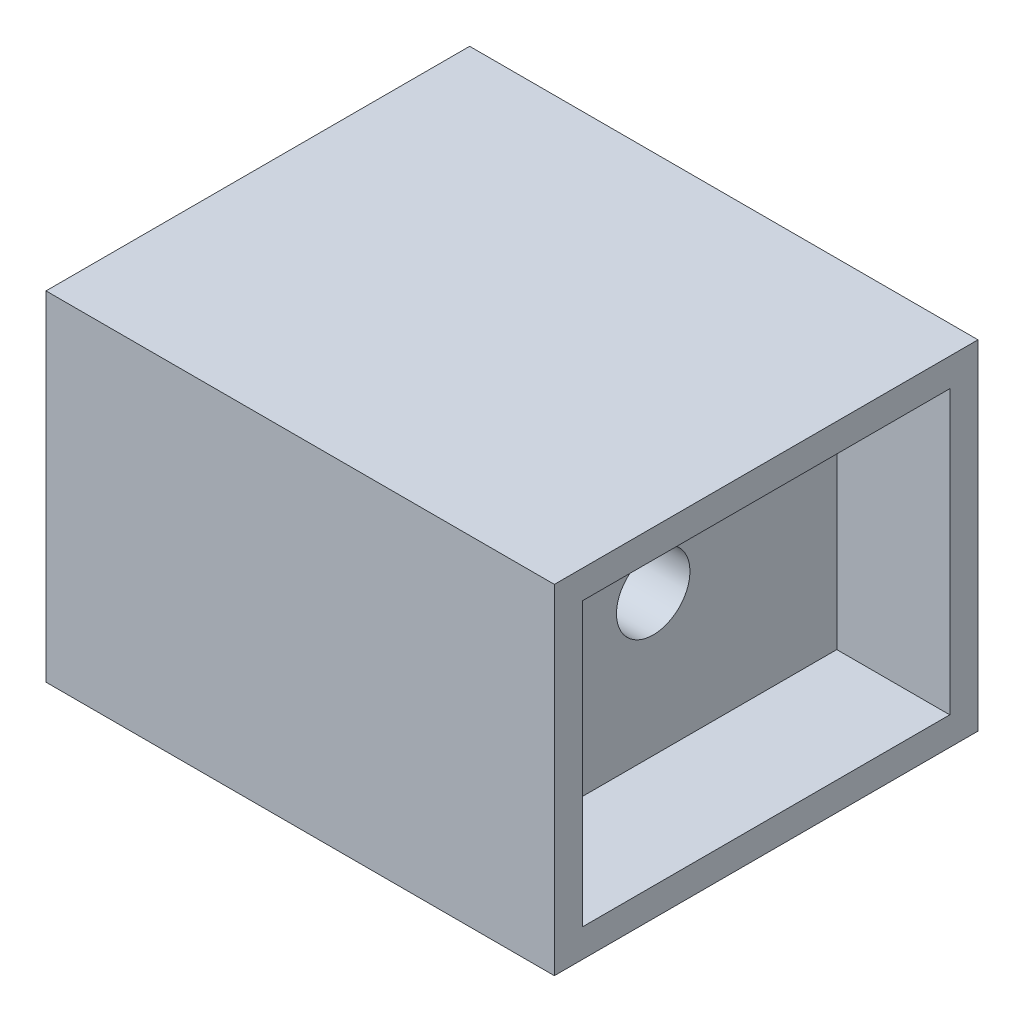
ISO-10303-21;
HEADER;
FILE_DESCRIPTION(('STEP AP214'),'2;1');
FILE_NAME('part.step','',(''),(''),'','','');
FILE_SCHEMA(('AUTOMOTIVE_DESIGN { 1 0 10303 214 1 1 1 1 }'));
ENDSEC;
DATA;
#1=APPLICATION_CONTEXT('core data for automotive mechanical design processes');
#2=APPLICATION_PROTOCOL_DEFINITION('international standard','automotive_design',2000,#1);
#3=PRODUCT_CONTEXT('',#1,'mechanical');
#4=PRODUCT('Part','Part','',(#3));
#5=PRODUCT_RELATED_PRODUCT_CATEGORY('part','',(#4));
#6=PRODUCT_DEFINITION_FORMATION('','',#4);
#7=PRODUCT_DEFINITION_CONTEXT('part definition',#1,'design');
#8=PRODUCT_DEFINITION('design','',#6,#7);
#9=PRODUCT_DEFINITION_SHAPE('','',#8);
#10=(LENGTH_UNIT() NAMED_UNIT(*) SI_UNIT(.MILLI.,.METRE.));
#11=(NAMED_UNIT(*) PLANE_ANGLE_UNIT() SI_UNIT($,.RADIAN.));
#12=(NAMED_UNIT(*) SI_UNIT($,.STERADIAN.) SOLID_ANGLE_UNIT());
#13=UNCERTAINTY_MEASURE_WITH_UNIT(LENGTH_MEASURE(1.E-05),#10,'distance_accuracy_value','');
#14=(GEOMETRIC_REPRESENTATION_CONTEXT(3) GLOBAL_UNCERTAINTY_ASSIGNED_CONTEXT((#13)) GLOBAL_UNIT_ASSIGNED_CONTEXT((#10,
#11,#12)) REPRESENTATION_CONTEXT('',''));
#15=CARTESIAN_POINT('',(0.,0.,0.));
#16=DIRECTION('',(0.,0.,1.));
#17=DIRECTION('',(1.,0.,0.));
#18=AXIS2_PLACEMENT_3D('',#15,#16,#17);
#19=CARTESIAN_POINT('',(8.,6.,-7.5));
#20=DIRECTION('',(-1.,0.,0.));
#21=DIRECTION('',(0.,0.,1.));
#22=AXIS2_PLACEMENT_3D('',#19,#20,#21);
#23=CYLINDRICAL_SURFACE('',#22,1.3);
#24=CARTESIAN_POINT('',(4.,6.,-7.5));
#25=DIRECTION('',(-1.,0.,0.));
#26=DIRECTION('',(0.,0.,1.));
#27=AXIS2_PLACEMENT_3D('',#24,#25,#26);
#28=CIRCLE('',#27,1.3);
#29=CARTESIAN_POINT('',(4.,6.,-6.2));
#30=VERTEX_POINT('',#29);
#31=EDGE_CURVE('E179',#30,#30,#28,.T.);
#32=ORIENTED_EDGE('',*,*,#31,.F.);
#33=EDGE_LOOP('',(#32));
#34=FACE_BOUND('',#33,.T.);
#35=CARTESIAN_POINT('',(1.5,6.,-7.5));
#36=DIRECTION('',(-1.,0.,0.));
#37=DIRECTION('',(0.,0.,1.));
#38=AXIS2_PLACEMENT_3D('',#35,#36,#37);
#39=CIRCLE('',#38,1.3);
#40=CARTESIAN_POINT('',(1.5,6.,-6.2));
#41=VERTEX_POINT('',#40);
#42=EDGE_CURVE('E178',#41,#41,#39,.F.);
#43=ORIENTED_EDGE('',*,*,#42,.F.);
#44=EDGE_LOOP('',(#43));
#45=FACE_BOUND('',#44,.T.);
#46=ADVANCED_FACE('F36',(#34,#45),#23,.F.);
#47=CARTESIAN_POINT('',(4.,0.,0.));
#48=DIRECTION('',(-1.,0.,0.));
#49=DIRECTION('',(0.,0.,1.));
#50=AXIS2_PLACEMENT_3D('',#47,#48,#49);
#51=PLANE('',#50);
#52=ORIENTED_EDGE('',*,*,#31,.T.);
#53=EDGE_LOOP('',(#52));
#54=FACE_BOUND('',#53,.T.);
#55=DIRECTION('',(0.,0.,1.));
#56=VECTOR('',#55,1.);
#57=CARTESIAN_POINT('',(4.,1.,-1.));
#58=LINE('',#57,#56);
#59=CARTESIAN_POINT('',(4.,1.,-14.));
#60=VERTEX_POINT('',#59);
#61=CARTESIAN_POINT('',(4.,1.,-1.));
#62=VERTEX_POINT('',#61);
#63=EDGE_CURVE('E182',#60,#62,#58,.T.);
#64=ORIENTED_EDGE('',*,*,#63,.F.);
#65=DIRECTION('',(0.,-1.,0.));
#66=VECTOR('',#65,1.);
#67=CARTESIAN_POINT('',(4.,12.,-14.));
#68=LINE('',#67,#66);
#69=CARTESIAN_POINT('',(4.,11.,-14.));
#70=VERTEX_POINT('',#69);
#71=EDGE_CURVE('E200',#70,#60,#68,.T.);
#72=ORIENTED_EDGE('',*,*,#71,.F.);
#73=DIRECTION('',(0.,0.,-1.));
#74=VECTOR('',#73,1.);
#75=CARTESIAN_POINT('',(4.,11.,-1.));
#76=LINE('',#75,#74);
#77=CARTESIAN_POINT('',(4.,11.,-1.));
#78=VERTEX_POINT('',#77);
#79=EDGE_CURVE('E189',#78,#70,#76,.T.);
#80=ORIENTED_EDGE('',*,*,#79,.F.);
#81=DIRECTION('',(0.,1.,0.));
#82=VECTOR('',#81,1.);
#83=CARTESIAN_POINT('',(4.,12.,-1.));
#84=LINE('',#83,#82);
#85=EDGE_CURVE('E207',#62,#78,#84,.T.);
#86=ORIENTED_EDGE('',*,*,#85,.F.);
#87=EDGE_LOOP('',(#64,#72,#80,#86));
#88=FACE_BOUND('',#87,.T.);
#89=ADVANCED_FACE('F250',(#54,#88),#51,.F.);
#90=CARTESIAN_POINT('',(8.,12.,-1.));
#91=DIRECTION('',(0.,0.,1.));
#92=DIRECTION('',(1.,0.,0.));
#93=AXIS2_PLACEMENT_3D('',#90,#91,#92);
#94=PLANE('',#93);
#95=DIRECTION('',(-1.,0.,0.));
#96=VECTOR('',#95,1.);
#97=CARTESIAN_POINT('',(8.,1.,-1.));
#98=LINE('',#97,#96);
#99=CARTESIAN_POINT('',(8.,1.,-1.));
#100=VERTEX_POINT('',#99);
#101=EDGE_CURVE('E59',#100,#62,#98,.T.);
#102=ORIENTED_EDGE('',*,*,#101,.T.);
#103=ORIENTED_EDGE('',*,*,#85,.T.);
#104=DIRECTION('',(-1.,0.,0.));
#105=VECTOR('',#104,1.);
#106=CARTESIAN_POINT('',(8.,11.,-1.));
#107=LINE('',#106,#105);
#108=CARTESIAN_POINT('',(8.,11.,-1.));
#109=VERTEX_POINT('',#108);
#110=EDGE_CURVE('E197',#109,#78,#107,.T.);
#111=ORIENTED_EDGE('',*,*,#110,.F.);
#112=DIRECTION('',(0.,1.,0.));
#113=VECTOR('',#112,1.);
#114=CARTESIAN_POINT('',(8.,12.,-1.));
#115=LINE('',#114,#113);
#116=EDGE_CURVE('E215',#100,#109,#115,.T.);
#117=ORIENTED_EDGE('',*,*,#116,.F.);
#118=EDGE_LOOP('',(#102,#103,#111,#117));
#119=FACE_BOUND('',#118,.T.);
#120=ADVANCED_FACE('F256',(#119),#94,.F.);
#121=CARTESIAN_POINT('',(8.,12.,-14.));
#122=DIRECTION('',(0.,0.,-1.));
#123=DIRECTION('',(-1.,0.,0.));
#124=AXIS2_PLACEMENT_3D('',#121,#122,#123);
#125=PLANE('',#124);
#126=DIRECTION('',(-1.,0.,0.));
#127=VECTOR('',#126,1.);
#128=CARTESIAN_POINT('',(8.,1.,-14.));
#129=LINE('',#128,#127);
#130=CARTESIAN_POINT('',(8.,1.,-14.));
#131=VERTEX_POINT('',#130);
#132=EDGE_CURVE('E187',#131,#60,#129,.T.);
#133=ORIENTED_EDGE('',*,*,#132,.F.);
#134=DIRECTION('',(0.,-1.,0.));
#135=VECTOR('',#134,1.);
#136=CARTESIAN_POINT('',(8.,12.,-14.));
#137=LINE('',#136,#135);
#138=CARTESIAN_POINT('',(8.,11.,-14.));
#139=VERTEX_POINT('',#138);
#140=EDGE_CURVE('E204',#139,#131,#137,.T.);
#141=ORIENTED_EDGE('',*,*,#140,.F.);
#142=DIRECTION('',(-1.,0.,0.));
#143=VECTOR('',#142,1.);
#144=CARTESIAN_POINT('',(8.,11.,-14.));
#145=LINE('',#144,#143);
#146=EDGE_CURVE('E193',#139,#70,#145,.T.);
#147=ORIENTED_EDGE('',*,*,#146,.T.);
#148=ORIENTED_EDGE('',*,*,#71,.T.);
#149=EDGE_LOOP('',(#133,#141,#147,#148));
#150=FACE_BOUND('',#149,.T.);
#151=ADVANCED_FACE('F271',(#150),#125,.F.);
#152=CARTESIAN_POINT('',(4.,0.,0.));
#153=DIRECTION('',(0.,0.,-1.));
#154=DIRECTION('',(-1.,0.,0.));
#155=AXIS2_PLACEMENT_3D('',#152,#153,#154);
#156=PLANE('',#155);
#157=DIRECTION('',(-1.,0.,0.));
#158=VECTOR('',#157,1.);
#159=CARTESIAN_POINT('',(4.,12.,0.));
#160=LINE('',#159,#158);
#161=CARTESIAN_POINT('',(8.,12.,0.));
#162=VERTEX_POINT('',#161);
#163=CARTESIAN_POINT('',(-9.99999999999999,12.,0.));
#164=VERTEX_POINT('',#163);
#165=EDGE_CURVE('E220',#162,#164,#160,.T.);
#166=ORIENTED_EDGE('',*,*,#165,.T.);
#167=DIRECTION('',(0.,1.,0.));
#168=VECTOR('',#167,1.);
#169=CARTESIAN_POINT('',(-9.99999999999999,0.,0.));
#170=LINE('',#169,#168);
#171=CARTESIAN_POINT('',(-9.99999999999999,0.,0.));
#172=VERTEX_POINT('',#171);
#173=EDGE_CURVE('E166',#172,#164,#170,.T.);
#174=ORIENTED_EDGE('',*,*,#173,.F.);
#175=DIRECTION('',(-1.,0.,0.));
#176=VECTOR('',#175,1.);
#177=CARTESIAN_POINT('',(4.,0.,0.));
#178=LINE('',#177,#176);
#179=CARTESIAN_POINT('',(8.,0.,0.));
#180=VERTEX_POINT('',#179);
#181=EDGE_CURVE('E227',#180,#172,#178,.T.);
#182=ORIENTED_EDGE('',*,*,#181,.F.);
#183=DIRECTION('',(0.,-1.,0.));
#184=VECTOR('',#183,1.);
#185=CARTESIAN_POINT('',(8.,12.,0.));
#186=LINE('',#185,#184);
#187=EDGE_CURVE('E210',#162,#180,#186,.T.);
#188=ORIENTED_EDGE('',*,*,#187,.F.);
#189=EDGE_LOOP('',(#166,#174,#182,#188));
#190=FACE_BOUND('',#189,.T.);
#191=ADVANCED_FACE('F274',(#190),#156,.F.);
#192=CARTESIAN_POINT('',(4.,0.,0.));
#193=DIRECTION('',(0.,1.,0.));
#194=DIRECTION('',(0.,0.,1.));
#195=AXIS2_PLACEMENT_3D('',#192,#193,#194);
#196=PLANE('',#195);
#197=ORIENTED_EDGE('',*,*,#181,.T.);
#198=DIRECTION('',(0.,0.,1.));
#199=VECTOR('',#198,1.);
#200=CARTESIAN_POINT('',(-9.99999999999999,0.,0.));
#201=LINE('',#200,#199);
#202=CARTESIAN_POINT('',(-9.99999999999999,0.,-15.));
#203=VERTEX_POINT('',#202);
#204=EDGE_CURVE('E160',#203,#172,#201,.T.);
#205=ORIENTED_EDGE('',*,*,#204,.F.);
#206=DIRECTION('',(-1.,0.,0.));
#207=VECTOR('',#206,1.);
#208=CARTESIAN_POINT('',(4.,0.,-15.));
#209=LINE('',#208,#207);
#210=CARTESIAN_POINT('',(8.,0.,-15.));
#211=VERTEX_POINT('',#210);
#212=EDGE_CURVE('E225',#211,#203,#209,.T.);
#213=ORIENTED_EDGE('',*,*,#212,.F.);
#214=DIRECTION('',(0.,0.,-1.));
#215=VECTOR('',#214,1.);
#216=CARTESIAN_POINT('',(8.,0.,0.));
#217=LINE('',#216,#215);
#218=EDGE_CURVE('E213',#180,#211,#217,.T.);
#219=ORIENTED_EDGE('',*,*,#218,.F.);
#220=EDGE_LOOP('',(#197,#205,#213,#219));
#221=FACE_BOUND('',#220,.T.);
#222=ADVANCED_FACE('F292',(#221),#196,.F.);
#223=CARTESIAN_POINT('',(4.,0.,-15.));
#224=DIRECTION('',(0.,0.,1.));
#225=DIRECTION('',(1.,0.,0.));
#226=AXIS2_PLACEMENT_3D('',#223,#224,#225);
#227=PLANE('',#226);
#228=ORIENTED_EDGE('',*,*,#212,.T.);
#229=DIRECTION('',(0.,-1.,0.));
#230=VECTOR('',#229,1.);
#231=CARTESIAN_POINT('',(-9.99999999999999,0.,-15.));
#232=LINE('',#231,#230);
#233=CARTESIAN_POINT('',(-9.99999999999999,12.,-15.));
#234=VERTEX_POINT('',#233);
#235=EDGE_CURVE('E172',#234,#203,#232,.T.);
#236=ORIENTED_EDGE('',*,*,#235,.F.);
#237=DIRECTION('',(-1.,0.,0.));
#238=VECTOR('',#237,1.);
#239=CARTESIAN_POINT('',(4.,12.,-15.));
#240=LINE('',#239,#238);
#241=CARTESIAN_POINT('',(8.,12.,-15.));
#242=VERTEX_POINT('',#241);
#243=EDGE_CURVE('E223',#242,#234,#240,.T.);
#244=ORIENTED_EDGE('',*,*,#243,.F.);
#245=DIRECTION('',(0.,1.,0.));
#246=VECTOR('',#245,1.);
#247=CARTESIAN_POINT('',(8.,12.,-15.));
#248=LINE('',#247,#246);
#249=EDGE_CURVE('E201',#211,#242,#248,.T.);
#250=ORIENTED_EDGE('',*,*,#249,.F.);
#251=EDGE_LOOP('',(#228,#236,#244,#250));
#252=FACE_BOUND('',#251,.T.);
#253=ADVANCED_FACE('F288',(#252),#227,.F.);
#254=CARTESIAN_POINT('',(4.,12.,0.));
#255=DIRECTION('',(0.,-1.,0.));
#256=DIRECTION('',(0.,0.,-1.));
#257=AXIS2_PLACEMENT_3D('',#254,#255,#256);
#258=PLANE('',#257);
#259=ORIENTED_EDGE('',*,*,#243,.T.);
#260=DIRECTION('',(0.,0.,-1.));
#261=VECTOR('',#260,1.);
#262=CARTESIAN_POINT('',(-9.99999999999999,12.,0.));
#263=LINE('',#262,#261);
#264=EDGE_CURVE('E169',#164,#234,#263,.T.);
#265=ORIENTED_EDGE('',*,*,#264,.F.);
#266=ORIENTED_EDGE('',*,*,#165,.F.);
#267=DIRECTION('',(0.,0.,1.));
#268=VECTOR('',#267,1.);
#269=CARTESIAN_POINT('',(8.,12.,0.));
#270=LINE('',#269,#268);
#271=EDGE_CURVE('E217',#242,#162,#270,.T.);
#272=ORIENTED_EDGE('',*,*,#271,.F.);
#273=EDGE_LOOP('',(#259,#265,#266,#272));
#274=FACE_BOUND('',#273,.T.);
#275=ADVANCED_FACE('F284',(#274),#258,.F.);
#276=CARTESIAN_POINT('',(0.,0.,0.));
#277=DIRECTION('',(-1.,0.,0.));
#278=DIRECTION('',(0.,0.,1.));
#279=AXIS2_PLACEMENT_3D('',#276,#277,#278);
#280=PLANE('',#279);
#281=CARTESIAN_POINT('',(0.,6.,-7.5));
#282=DIRECTION('',(-1.,0.,0.));
#283=DIRECTION('',(0.,0.,1.));
#284=AXIS2_PLACEMENT_3D('',#281,#282,#283);
#285=CIRCLE('',#284,3.5);
#286=CARTESIAN_POINT('',(0.,6.,-4.));
#287=VERTEX_POINT('',#286);
#288=EDGE_CURVE('E11',#287,#287,#285,.F.);
#289=ORIENTED_EDGE('',*,*,#288,.T.);
#290=EDGE_LOOP('',(#289));
#291=FACE_BOUND('',#290,.T.);
#292=DIRECTION('',(0.,1.,0.));
#293=VECTOR('',#292,1.);
#294=CARTESIAN_POINT('',(0.,10.1,-1.9));
#295=LINE('',#294,#293);
#296=CARTESIAN_POINT('',(0.,1.9,-1.9));
#297=VERTEX_POINT('',#296);
#298=CARTESIAN_POINT('',(0.,10.1,-1.9));
#299=VERTEX_POINT('',#298);
#300=EDGE_CURVE('E127',#297,#299,#295,.T.);
#301=ORIENTED_EDGE('',*,*,#300,.T.);
#302=DIRECTION('',(0.,0.,-1.));
#303=VECTOR('',#302,1.);
#304=CARTESIAN_POINT('',(0.,10.1,-1.9));
#305=LINE('',#304,#303);
#306=CARTESIAN_POINT('',(0.,10.1,-13.1));
#307=VERTEX_POINT('',#306);
#308=EDGE_CURVE('E136',#299,#307,#305,.T.);
#309=ORIENTED_EDGE('',*,*,#308,.T.);
#310=DIRECTION('',(0.,-1.,0.));
#311=VECTOR('',#310,1.);
#312=CARTESIAN_POINT('',(0.,10.1,-13.1));
#313=LINE('',#312,#311);
#314=CARTESIAN_POINT('',(0.,1.9,-13.1));
#315=VERTEX_POINT('',#314);
#316=EDGE_CURVE('E141',#307,#315,#313,.T.);
#317=ORIENTED_EDGE('',*,*,#316,.T.);
#318=DIRECTION('',(0.,0.,1.));
#319=VECTOR('',#318,1.);
#320=CARTESIAN_POINT('',(0.,1.9,-1.9));
#321=LINE('',#320,#319);
#322=EDGE_CURVE('E133',#315,#297,#321,.T.);
#323=ORIENTED_EDGE('',*,*,#322,.T.);
#324=EDGE_LOOP('',(#301,#309,#317,#323));
#325=FACE_BOUND('',#324,.T.);
#326=ADVANCED_FACE('F143',(#291,#325),#280,.T.);
#327=CARTESIAN_POINT('',(8.,0.,0.));
#328=DIRECTION('',(1.,0.,0.));
#329=DIRECTION('',(0.,0.,-1.));
#330=AXIS2_PLACEMENT_3D('',#327,#328,#329);
#331=PLANE('',#330);
#332=ORIENTED_EDGE('',*,*,#140,.T.);
#333=DIRECTION('',(0.,0.,1.));
#334=VECTOR('',#333,1.);
#335=CARTESIAN_POINT('',(8.,1.,-1.));
#336=LINE('',#335,#334);
#337=EDGE_CURVE('E183',#131,#100,#336,.T.);
#338=ORIENTED_EDGE('',*,*,#337,.T.);
#339=ORIENTED_EDGE('',*,*,#116,.T.);
#340=DIRECTION('',(0.,0.,-1.));
#341=VECTOR('',#340,1.);
#342=CARTESIAN_POINT('',(8.,11.,-1.));
#343=LINE('',#342,#341);
#344=EDGE_CURVE('E190',#109,#139,#343,.T.);
#345=ORIENTED_EDGE('',*,*,#344,.T.);
#346=EDGE_LOOP('',(#332,#338,#339,#345));
#347=FACE_BOUND('',#346,.T.);
#348=ORIENTED_EDGE('',*,*,#187,.T.);
#349=ORIENTED_EDGE('',*,*,#218,.T.);
#350=ORIENTED_EDGE('',*,*,#249,.T.);
#351=ORIENTED_EDGE('',*,*,#271,.T.);
#352=EDGE_LOOP('',(#348,#349,#350,#351));
#353=FACE_BOUND('',#352,.T.);
#354=ADVANCED_FACE('F269',(#347,#353),#331,.T.);
#355=CARTESIAN_POINT('',(8.,11.,-1.));
#356=DIRECTION('',(0.,1.,0.));
#357=DIRECTION('',(0.,0.,1.));
#358=AXIS2_PLACEMENT_3D('',#355,#356,#357);
#359=PLANE('',#358);
#360=ORIENTED_EDGE('',*,*,#79,.T.);
#361=ORIENTED_EDGE('',*,*,#146,.F.);
#362=ORIENTED_EDGE('',*,*,#344,.F.);
#363=ORIENTED_EDGE('',*,*,#110,.T.);
#364=EDGE_LOOP('',(#360,#361,#362,#363));
#365=FACE_BOUND('',#364,.T.);
#366=ADVANCED_FACE('F266',(#365),#359,.F.);
#367=CARTESIAN_POINT('',(8.,1.,-1.));
#368=DIRECTION('',(0.,-1.,0.));
#369=DIRECTION('',(0.,0.,-1.));
#370=AXIS2_PLACEMENT_3D('',#367,#368,#369);
#371=PLANE('',#370);
#372=ORIENTED_EDGE('',*,*,#63,.T.);
#373=ORIENTED_EDGE('',*,*,#101,.F.);
#374=ORIENTED_EDGE('',*,*,#337,.F.);
#375=ORIENTED_EDGE('',*,*,#132,.T.);
#376=EDGE_LOOP('',(#372,#373,#374,#375));
#377=FACE_BOUND('',#376,.T.);
#378=ADVANCED_FACE('F263',(#377),#371,.F.);
#379=CARTESIAN_POINT('',(1.5,6.,-7.5));
#380=DIRECTION('',(-1.,0.,0.));
#381=DIRECTION('',(0.,0.,1.));
#382=AXIS2_PLACEMENT_3D('',#379,#380,#381);
#383=PLANE('',#382);
#384=CARTESIAN_POINT('',(1.5,6.,-7.5));
#385=DIRECTION('',(-1.,0.,0.));
#386=DIRECTION('',(0.,0.,1.));
#387=AXIS2_PLACEMENT_3D('',#384,#385,#386);
#388=CIRCLE('',#387,2.5);
#389=CARTESIAN_POINT('',(1.5,6.,-5.));
#390=VERTEX_POINT('',#389);
#391=EDGE_CURVE('E175',#390,#390,#388,.T.);
#392=ORIENTED_EDGE('',*,*,#391,.T.);
#393=EDGE_LOOP('',(#392));
#394=FACE_BOUND('',#393,.T.);
#395=ORIENTED_EDGE('',*,*,#42,.T.);
#396=EDGE_LOOP('',(#395));
#397=FACE_BOUND('',#396,.T.);
#398=ADVANCED_FACE('F246',(#394,#397),#383,.T.);
#399=CARTESIAN_POINT('',(1.5,6.,-7.5));
#400=DIRECTION('',(-1.,0.,0.));
#401=DIRECTION('',(0.,0.,1.));
#402=AXIS2_PLACEMENT_3D('',#399,#400,#401);
#403=CYLINDRICAL_SURFACE('',#402,2.5);
#404=CARTESIAN_POINT('',(0.999999999999994,6.,-7.5));
#405=DIRECTION('',(-1.,0.,0.));
#406=DIRECTION('',(0.,0.,1.));
#407=AXIS2_PLACEMENT_3D('',#404,#405,#406);
#408=CIRCLE('',#407,2.5);
#409=CARTESIAN_POINT('',(0.999999999999994,6.,-5.));
#410=VERTEX_POINT('',#409);
#411=EDGE_CURVE('E44',#410,#410,#408,.T.);
#412=ORIENTED_EDGE('',*,*,#411,.T.);
#413=EDGE_LOOP('',(#412));
#414=FACE_BOUND('',#413,.T.);
#415=ORIENTED_EDGE('',*,*,#391,.F.);
#416=EDGE_LOOP('',(#415));
#417=FACE_BOUND('',#416,.T.);
#418=ADVANCED_FACE('F233',(#414,#417),#403,.F.);
#419=CARTESIAN_POINT('',(0.999999999999994,6.,-7.5));
#420=DIRECTION('',(-1.,0.,0.));
#421=DIRECTION('',(0.,0.,1.));
#422=AXIS2_PLACEMENT_3D('',#419,#420,#421);
#423=CONICAL_SURFACE('',#422,2.5,0.785398163397451);
#424=ORIENTED_EDGE('',*,*,#288,.F.);
#425=EDGE_LOOP('',(#424));
#426=FACE_BOUND('',#425,.T.);
#427=ORIENTED_EDGE('',*,*,#411,.F.);
#428=EDGE_LOOP('',(#427));
#429=FACE_BOUND('',#428,.T.);
#430=ADVANCED_FACE('F38',(#426,#429),#423,.F.);
#431=CARTESIAN_POINT('',(-9.99999999999999,0.,0.));
#432=DIRECTION('',(-1.,0.,0.));
#433=DIRECTION('',(0.,0.,1.));
#434=AXIS2_PLACEMENT_3D('',#431,#432,#433);
#435=PLANE('',#434);
#436=DIRECTION('',(0.,1.,0.));
#437=VECTOR('',#436,1.);
#438=CARTESIAN_POINT('',(-9.99999999999999,10.1,-1.9));
#439=LINE('',#438,#437);
#440=CARTESIAN_POINT('',(-9.99999999999999,1.9,-1.9));
#441=VERTEX_POINT('',#440);
#442=CARTESIAN_POINT('',(-9.99999999999999,10.1,-1.9));
#443=VERTEX_POINT('',#442);
#444=EDGE_CURVE('E51',#441,#443,#439,.T.);
#445=ORIENTED_EDGE('',*,*,#444,.F.);
#446=DIRECTION('',(0.,0.,1.));
#447=VECTOR('',#446,1.);
#448=CARTESIAN_POINT('',(-9.99999999999999,1.9,-1.9));
#449=LINE('',#448,#447);
#450=CARTESIAN_POINT('',(-9.99999999999999,1.9,-13.1));
#451=VERTEX_POINT('',#450);
#452=EDGE_CURVE('E145',#451,#441,#449,.T.);
#453=ORIENTED_EDGE('',*,*,#452,.F.);
#454=DIRECTION('',(0.,-1.,0.));
#455=VECTOR('',#454,1.);
#456=CARTESIAN_POINT('',(-9.99999999999999,10.1,-13.1));
#457=LINE('',#456,#455);
#458=CARTESIAN_POINT('',(-9.99999999999999,10.1,-13.1));
#459=VERTEX_POINT('',#458);
#460=EDGE_CURVE('E148',#459,#451,#457,.T.);
#461=ORIENTED_EDGE('',*,*,#460,.F.);
#462=DIRECTION('',(0.,0.,-1.));
#463=VECTOR('',#462,1.);
#464=CARTESIAN_POINT('',(-9.99999999999999,10.1,-1.9));
#465=LINE('',#464,#463);
#466=EDGE_CURVE('E154',#443,#459,#465,.T.);
#467=ORIENTED_EDGE('',*,*,#466,.F.);
#468=EDGE_LOOP('',(#445,#453,#461,#467));
#469=FACE_BOUND('',#468,.T.);
#470=ORIENTED_EDGE('',*,*,#204,.T.);
#471=ORIENTED_EDGE('',*,*,#173,.T.);
#472=ORIENTED_EDGE('',*,*,#264,.T.);
#473=ORIENTED_EDGE('',*,*,#235,.T.);
#474=EDGE_LOOP('',(#470,#471,#472,#473));
#475=FACE_BOUND('',#474,.T.);
#476=ADVANCED_FACE('F237',(#469,#475),#435,.T.);
#477=CARTESIAN_POINT('',(0.,10.1,-1.9));
#478=DIRECTION('',(0.,0.,1.));
#479=DIRECTION('',(1.,0.,0.));
#480=AXIS2_PLACEMENT_3D('',#477,#478,#479);
#481=PLANE('',#480);
#482=ORIENTED_EDGE('',*,*,#444,.T.);
#483=DIRECTION('',(-1.,0.,0.));
#484=VECTOR('',#483,1.);
#485=CARTESIAN_POINT('',(0.,10.1,-1.9));
#486=LINE('',#485,#484);
#487=EDGE_CURVE('E123',#299,#443,#486,.T.);
#488=ORIENTED_EDGE('',*,*,#487,.F.);
#489=ORIENTED_EDGE('',*,*,#300,.F.);
#490=DIRECTION('',(-1.,0.,0.));
#491=VECTOR('',#490,1.);
#492=CARTESIAN_POINT('',(0.,1.9,-1.9));
#493=LINE('',#492,#491);
#494=EDGE_CURVE('E158',#297,#441,#493,.T.);
#495=ORIENTED_EDGE('',*,*,#494,.T.);
#496=EDGE_LOOP('',(#482,#488,#489,#495));
#497=FACE_BOUND('',#496,.T.);
#498=ADVANCED_FACE('F125',(#497),#481,.F.);
#499=CARTESIAN_POINT('',(0.,1.9,-1.9));
#500=DIRECTION('',(0.,-1.,0.));
#501=DIRECTION('',(0.,0.,-1.));
#502=AXIS2_PLACEMENT_3D('',#499,#500,#501);
#503=PLANE('',#502);
#504=ORIENTED_EDGE('',*,*,#452,.T.);
#505=ORIENTED_EDGE('',*,*,#494,.F.);
#506=ORIENTED_EDGE('',*,*,#322,.F.);
#507=DIRECTION('',(-1.,0.,0.));
#508=VECTOR('',#507,1.);
#509=CARTESIAN_POINT('',(0.,1.9,-13.1));
#510=LINE('',#509,#508);
#511=EDGE_CURVE('E161',#315,#451,#510,.T.);
#512=ORIENTED_EDGE('',*,*,#511,.T.);
#513=EDGE_LOOP('',(#504,#505,#506,#512));
#514=FACE_BOUND('',#513,.T.);
#515=ADVANCED_FACE('F439',(#514),#503,.F.);
#516=CARTESIAN_POINT('',(0.,10.1,-13.1));
#517=DIRECTION('',(0.,0.,-1.));
#518=DIRECTION('',(-1.,0.,0.));
#519=AXIS2_PLACEMENT_3D('',#516,#517,#518);
#520=PLANE('',#519);
#521=ORIENTED_EDGE('',*,*,#460,.T.);
#522=ORIENTED_EDGE('',*,*,#511,.F.);
#523=ORIENTED_EDGE('',*,*,#316,.F.);
#524=DIRECTION('',(-1.,0.,0.));
#525=VECTOR('',#524,1.);
#526=CARTESIAN_POINT('',(0.,10.1,-13.1));
#527=LINE('',#526,#525);
#528=EDGE_CURVE('E132',#307,#459,#527,.T.);
#529=ORIENTED_EDGE('',*,*,#528,.T.);
#530=EDGE_LOOP('',(#521,#522,#523,#529));
#531=FACE_BOUND('',#530,.T.);
#532=ADVANCED_FACE('F447',(#531),#520,.F.);
#533=CARTESIAN_POINT('',(0.,10.1,-1.9));
#534=DIRECTION('',(0.,1.,0.));
#535=DIRECTION('',(0.,0.,1.));
#536=AXIS2_PLACEMENT_3D('',#533,#534,#535);
#537=PLANE('',#536);
#538=ORIENTED_EDGE('',*,*,#466,.T.);
#539=ORIENTED_EDGE('',*,*,#528,.F.);
#540=ORIENTED_EDGE('',*,*,#308,.F.);
#541=ORIENTED_EDGE('',*,*,#487,.T.);
#542=EDGE_LOOP('',(#538,#539,#540,#541));
#543=FACE_BOUND('',#542,.T.);
#544=ADVANCED_FACE('F137',(#543),#537,.F.);
#545=CLOSED_SHELL('',(#46,#89,#120,#151,#191,#222,#253,#275,#326,#354,#366,#378,#398,#418,#430,
#476,#498,#515,#532,#544));
#546=MANIFOLD_SOLID_BREP('B2',#545);
#547=ADVANCED_BREP_SHAPE_REPRESENTATION('',(#18,#546),#14);
#548=SHAPE_DEFINITION_REPRESENTATION(#9,#547);
ENDSEC;
END-ISO-10303-21;
